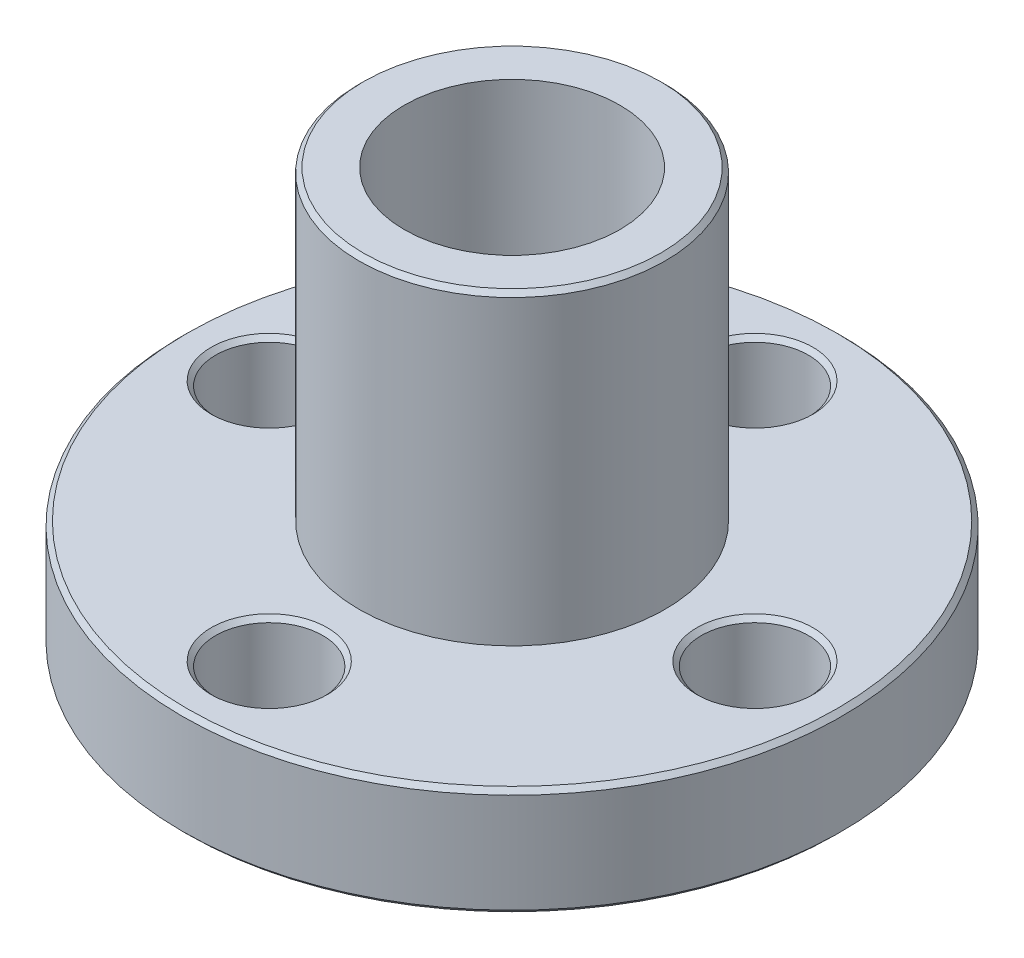
ISO-10303-21;
HEADER;
FILE_DESCRIPTION(('STEP AP214'),'2;1');
FILE_NAME('part.step','',(''),(''),'','','');
FILE_SCHEMA(('AUTOMOTIVE_DESIGN { 1 0 10303 214 1 1 1 1 }'));
ENDSEC;
DATA;
#1=APPLICATION_CONTEXT('core data for automotive mechanical design processes');
#2=APPLICATION_PROTOCOL_DEFINITION('international standard','automotive_design',2000,#1);
#3=PRODUCT_CONTEXT('',#1,'mechanical');
#4=PRODUCT('Part','Part','',(#3));
#5=PRODUCT_RELATED_PRODUCT_CATEGORY('part','',(#4));
#6=PRODUCT_DEFINITION_FORMATION('','',#4);
#7=PRODUCT_DEFINITION_CONTEXT('part definition',#1,'design');
#8=PRODUCT_DEFINITION('design','',#6,#7);
#9=PRODUCT_DEFINITION_SHAPE('','',#8);
#10=(LENGTH_UNIT() NAMED_UNIT(*) SI_UNIT(.MILLI.,.METRE.));
#11=(NAMED_UNIT(*) PLANE_ANGLE_UNIT() SI_UNIT($,.RADIAN.));
#12=(NAMED_UNIT(*) SI_UNIT($,.STERADIAN.) SOLID_ANGLE_UNIT());
#13=UNCERTAINTY_MEASURE_WITH_UNIT(LENGTH_MEASURE(1.E-05),#10,'distance_accuracy_value','');
#14=(GEOMETRIC_REPRESENTATION_CONTEXT(3) GLOBAL_UNCERTAINTY_ASSIGNED_CONTEXT((#13)) GLOBAL_UNIT_ASSIGNED_CONTEXT((#10,
#11,#12)) REPRESENTATION_CONTEXT('',''));
#15=CARTESIAN_POINT('',(0.,0.,0.));
#16=DIRECTION('',(0.,0.,1.));
#17=DIRECTION('',(1.,0.,0.));
#18=AXIS2_PLACEMENT_3D('',#15,#16,#17);
#19=CARTESIAN_POINT('',(0.,3.6,0.));
#20=DIRECTION('',(0.,-1.,0.));
#21=DIRECTION('',(0.,0.,-1.));
#22=AXIS2_PLACEMENT_3D('',#19,#20,#21);
#23=CYLINDRICAL_SURFACE('',#22,10.925);
#24=CARTESIAN_POINT('',(0.,3.45,0.));
#25=DIRECTION('',(0.,1.,0.));
#26=DIRECTION('',(0.,0.,1.));
#27=AXIS2_PLACEMENT_3D('',#24,#25,#26);
#28=CIRCLE('',#27,10.925);
#29=CARTESIAN_POINT('',(0.,3.45,10.925));
#30=VERTEX_POINT('',#29);
#31=EDGE_CURVE('E41',#30,#30,#28,.F.);
#32=ORIENTED_EDGE('',*,*,#31,.T.);
#33=EDGE_LOOP('',(#32));
#34=FACE_BOUND('',#33,.T.);
#35=CARTESIAN_POINT('',(0.,0.150000000000001,0.));
#36=DIRECTION('',(0.,1.,0.));
#37=DIRECTION('',(0.,0.,1.));
#38=AXIS2_PLACEMENT_3D('',#35,#36,#37);
#39=CIRCLE('',#38,10.925);
#40=CARTESIAN_POINT('',(0.,0.150000000000001,10.925));
#41=VERTEX_POINT('',#40);
#42=EDGE_CURVE('E45',#41,#41,#39,.T.);
#43=ORIENTED_EDGE('',*,*,#42,.T.);
#44=EDGE_LOOP('',(#43));
#45=FACE_BOUND('',#44,.T.);
#46=ADVANCED_FACE('F30',(#34,#45),#23,.T.);
#47=CARTESIAN_POINT('',(0.,3.6,0.));
#48=DIRECTION('',(0.,1.,0.));
#49=DIRECTION('',(0.,0.,1.));
#50=AXIS2_PLACEMENT_3D('',#47,#48,#49);
#51=PLANE('',#50);
#52=CARTESIAN_POINT('',(8.05,3.6,0.));
#53=DIRECTION('',(0.,1.,0.));
#54=DIRECTION('',(0.,0.,1.));
#55=AXIS2_PLACEMENT_3D('',#52,#53,#54);
#56=CIRCLE('',#55,1.925);
#57=CARTESIAN_POINT('',(8.05,3.6,1.925));
#58=VERTEX_POINT('',#57);
#59=EDGE_CURVE('E89',#58,#58,#56,.F.);
#60=ORIENTED_EDGE('',*,*,#59,.T.);
#61=EDGE_LOOP('',(#60));
#62=FACE_BOUND('',#61,.T.);
#63=CARTESIAN_POINT('',(0.,3.6,-8.05));
#64=DIRECTION('',(0.,1.,0.));
#65=DIRECTION('',(0.,0.,1.));
#66=AXIS2_PLACEMENT_3D('',#63,#64,#65);
#67=CIRCLE('',#66,1.925);
#68=CARTESIAN_POINT('',(0.,3.6,-6.125));
#69=VERTEX_POINT('',#68);
#70=EDGE_CURVE('E92',#69,#69,#67,.F.);
#71=ORIENTED_EDGE('',*,*,#70,.T.);
#72=EDGE_LOOP('',(#71));
#73=FACE_BOUND('',#72,.T.);
#74=CARTESIAN_POINT('',(0.,3.6,8.05));
#75=DIRECTION('',(0.,1.,0.));
#76=DIRECTION('',(0.,0.,1.));
#77=AXIS2_PLACEMENT_3D('',#74,#75,#76);
#78=CIRCLE('',#77,1.925);
#79=CARTESIAN_POINT('',(0.,3.6,9.975));
#80=VERTEX_POINT('',#79);
#81=EDGE_CURVE('E95',#80,#80,#78,.F.);
#82=ORIENTED_EDGE('',*,*,#81,.T.);
#83=EDGE_LOOP('',(#82));
#84=FACE_BOUND('',#83,.T.);
#85=CARTESIAN_POINT('',(-8.05,3.6,0.));
#86=DIRECTION('',(0.,1.,0.));
#87=DIRECTION('',(0.,0.,1.));
#88=AXIS2_PLACEMENT_3D('',#85,#86,#87);
#89=CIRCLE('',#88,1.925);
#90=CARTESIAN_POINT('',(-8.05,3.6,1.925));
#91=VERTEX_POINT('',#90);
#92=EDGE_CURVE('E98',#91,#91,#89,.F.);
#93=ORIENTED_EDGE('',*,*,#92,.T.);
#94=EDGE_LOOP('',(#93));
#95=FACE_BOUND('',#94,.T.);
#96=CARTESIAN_POINT('',(0.,3.6,0.));
#97=DIRECTION('',(0.,1.,0.));
#98=DIRECTION('',(0.,0.,1.));
#99=AXIS2_PLACEMENT_3D('',#96,#97,#98);
#100=CIRCLE('',#99,10.775);
#101=CARTESIAN_POINT('',(0.,3.6,10.775));
#102=VERTEX_POINT('',#101);
#103=EDGE_CURVE('E101',#102,#102,#100,.T.);
#104=ORIENTED_EDGE('',*,*,#103,.T.);
#105=EDGE_LOOP('',(#104));
#106=FACE_BOUND('',#105,.T.);
#107=CARTESIAN_POINT('',(0.,3.6,0.));
#108=DIRECTION('',(0.,1.,0.));
#109=DIRECTION('',(0.,0.,1.));
#110=AXIS2_PLACEMENT_3D('',#107,#108,#109);
#111=CIRCLE('',#110,5.075);
#112=CARTESIAN_POINT('',(0.,3.6,5.075));
#113=VERTEX_POINT('',#112);
#114=EDGE_CURVE('E113',#113,#113,#111,.T.);
#115=ORIENTED_EDGE('',*,*,#114,.F.);
#116=EDGE_LOOP('',(#115));
#117=FACE_BOUND('',#116,.T.);
#118=ADVANCED_FACE('F139',(#62,#73,#84,#95,#106,#117),#51,.T.);
#119=CARTESIAN_POINT('',(0.,0.,0.));
#120=DIRECTION('',(0.,1.,0.));
#121=DIRECTION('',(0.,0.,1.));
#122=AXIS2_PLACEMENT_3D('',#119,#120,#121);
#123=PLANE('',#122);
#124=CARTESIAN_POINT('',(8.05,0.,0.));
#125=DIRECTION('',(0.,1.,0.));
#126=DIRECTION('',(0.,0.,1.));
#127=AXIS2_PLACEMENT_3D('',#124,#125,#126);
#128=CIRCLE('',#127,1.925);
#129=CARTESIAN_POINT('',(8.05,0.,1.925));
#130=VERTEX_POINT('',#129);
#131=EDGE_CURVE('E56',#130,#130,#128,.T.);
#132=ORIENTED_EDGE('',*,*,#131,.T.);
#133=EDGE_LOOP('',(#132));
#134=FACE_BOUND('',#133,.T.);
#135=CARTESIAN_POINT('',(0.,0.,-8.05));
#136=DIRECTION('',(0.,1.,0.));
#137=DIRECTION('',(0.,0.,1.));
#138=AXIS2_PLACEMENT_3D('',#135,#136,#137);
#139=CIRCLE('',#138,1.925);
#140=CARTESIAN_POINT('',(0.,0.,-6.125));
#141=VERTEX_POINT('',#140);
#142=EDGE_CURVE('E59',#141,#141,#139,.T.);
#143=ORIENTED_EDGE('',*,*,#142,.T.);
#144=EDGE_LOOP('',(#143));
#145=FACE_BOUND('',#144,.T.);
#146=CARTESIAN_POINT('',(-8.05,0.,0.));
#147=DIRECTION('',(0.,1.,0.));
#148=DIRECTION('',(0.,0.,1.));
#149=AXIS2_PLACEMENT_3D('',#146,#147,#148);
#150=CIRCLE('',#149,1.925);
#151=CARTESIAN_POINT('',(-8.05,0.,1.925));
#152=VERTEX_POINT('',#151);
#153=EDGE_CURVE('E62',#152,#152,#150,.T.);
#154=ORIENTED_EDGE('',*,*,#153,.T.);
#155=EDGE_LOOP('',(#154));
#156=FACE_BOUND('',#155,.T.);
#157=CARTESIAN_POINT('',(0.,0.,8.05));
#158=DIRECTION('',(0.,1.,0.));
#159=DIRECTION('',(0.,0.,1.));
#160=AXIS2_PLACEMENT_3D('',#157,#158,#159);
#161=CIRCLE('',#160,1.925);
#162=CARTESIAN_POINT('',(0.,0.,9.975));
#163=VERTEX_POINT('',#162);
#164=EDGE_CURVE('E65',#163,#163,#161,.T.);
#165=ORIENTED_EDGE('',*,*,#164,.T.);
#166=EDGE_LOOP('',(#165));
#167=FACE_BOUND('',#166,.T.);
#168=CARTESIAN_POINT('',(0.,0.,0.));
#169=DIRECTION('',(0.,1.,0.));
#170=DIRECTION('',(0.,0.,1.));
#171=AXIS2_PLACEMENT_3D('',#168,#169,#170);
#172=CIRCLE('',#171,10.775);
#173=CARTESIAN_POINT('',(0.,0.,10.775));
#174=VERTEX_POINT('',#173);
#175=EDGE_CURVE('E68',#174,#174,#172,.F.);
#176=ORIENTED_EDGE('',*,*,#175,.T.);
#177=EDGE_LOOP('',(#176));
#178=FACE_BOUND('',#177,.T.);
#179=CARTESIAN_POINT('',(0.,0.,0.));
#180=DIRECTION('',(0.,1.,0.));
#181=DIRECTION('',(0.,0.,1.));
#182=AXIS2_PLACEMENT_3D('',#179,#180,#181);
#183=CIRCLE('',#182,5.075);
#184=CARTESIAN_POINT('',(0.,0.,5.075));
#185=VERTEX_POINT('',#184);
#186=EDGE_CURVE('E110',#185,#185,#183,.F.);
#187=ORIENTED_EDGE('',*,*,#186,.F.);
#188=EDGE_LOOP('',(#187));
#189=FACE_BOUND('',#188,.T.);
#190=ADVANCED_FACE('F145',(#134,#145,#156,#167,#178,#189),#123,.F.);
#191=CARTESIAN_POINT('',(-8.05,0.,0.));
#192=DIRECTION('',(0.,1.,0.));
#193=DIRECTION('',(0.,0.,1.));
#194=AXIS2_PLACEMENT_3D('',#191,#192,#193);
#195=CYLINDRICAL_SURFACE('',#194,1.775);
#196=CARTESIAN_POINT('',(-8.05,3.45,0.));
#197=DIRECTION('',(0.,1.,0.));
#198=DIRECTION('',(0.,0.,1.));
#199=AXIS2_PLACEMENT_3D('',#196,#197,#198);
#200=CIRCLE('',#199,1.775);
#201=CARTESIAN_POINT('',(-8.05,3.45,1.775));
#202=VERTEX_POINT('',#201);
#203=EDGE_CURVE('E71',#202,#202,#200,.T.);
#204=ORIENTED_EDGE('',*,*,#203,.T.);
#205=EDGE_LOOP('',(#204));
#206=FACE_BOUND('',#205,.T.);
#207=CARTESIAN_POINT('',(-8.05,0.15,0.));
#208=DIRECTION('',(0.,1.,0.));
#209=DIRECTION('',(0.,0.,1.));
#210=AXIS2_PLACEMENT_3D('',#207,#208,#209);
#211=CIRCLE('',#210,1.775);
#212=CARTESIAN_POINT('',(-8.05,0.15,1.775));
#213=VERTEX_POINT('',#212);
#214=EDGE_CURVE('E74',#213,#213,#211,.F.);
#215=ORIENTED_EDGE('',*,*,#214,.T.);
#216=EDGE_LOOP('',(#215));
#217=FACE_BOUND('',#216,.T.);
#218=ADVANCED_FACE('F202',(#206,#217),#195,.F.);
#219=CARTESIAN_POINT('',(0.,0.,-8.05));
#220=DIRECTION('',(0.,1.,0.));
#221=DIRECTION('',(0.,0.,1.));
#222=AXIS2_PLACEMENT_3D('',#219,#220,#221);
#223=CYLINDRICAL_SURFACE('',#222,1.775);
#224=CARTESIAN_POINT('',(0.,3.45,-8.05));
#225=DIRECTION('',(0.,1.,0.));
#226=DIRECTION('',(0.,0.,1.));
#227=AXIS2_PLACEMENT_3D('',#224,#225,#226);
#228=CIRCLE('',#227,1.775);
#229=CARTESIAN_POINT('',(0.,3.45,-6.275));
#230=VERTEX_POINT('',#229);
#231=EDGE_CURVE('E83',#230,#230,#228,.T.);
#232=ORIENTED_EDGE('',*,*,#231,.T.);
#233=EDGE_LOOP('',(#232));
#234=FACE_BOUND('',#233,.T.);
#235=CARTESIAN_POINT('',(0.,0.149999999999999,-8.05));
#236=DIRECTION('',(0.,1.,0.));
#237=DIRECTION('',(0.,0.,1.));
#238=AXIS2_PLACEMENT_3D('',#235,#236,#237);
#239=CIRCLE('',#238,1.775);
#240=CARTESIAN_POINT('',(0.,0.149999999999999,-6.275));
#241=VERTEX_POINT('',#240);
#242=EDGE_CURVE('E86',#241,#241,#239,.F.);
#243=ORIENTED_EDGE('',*,*,#242,.T.);
#244=EDGE_LOOP('',(#243));
#245=FACE_BOUND('',#244,.T.);
#246=ADVANCED_FACE('F209',(#234,#245),#223,.F.);
#247=CARTESIAN_POINT('',(0.,0.,8.05));
#248=DIRECTION('',(0.,1.,0.));
#249=DIRECTION('',(0.,0.,1.));
#250=AXIS2_PLACEMENT_3D('',#247,#248,#249);
#251=CYLINDRICAL_SURFACE('',#250,1.775);
#252=CARTESIAN_POINT('',(0.,3.45,8.05));
#253=DIRECTION('',(0.,1.,0.));
#254=DIRECTION('',(0.,0.,1.));
#255=AXIS2_PLACEMENT_3D('',#252,#253,#254);
#256=CIRCLE('',#255,1.775);
#257=CARTESIAN_POINT('',(0.,3.45,9.825));
#258=VERTEX_POINT('',#257);
#259=EDGE_CURVE('E77',#258,#258,#256,.T.);
#260=ORIENTED_EDGE('',*,*,#259,.T.);
#261=EDGE_LOOP('',(#260));
#262=FACE_BOUND('',#261,.T.);
#263=CARTESIAN_POINT('',(0.,0.150000000000006,8.05));
#264=DIRECTION('',(0.,1.,0.));
#265=DIRECTION('',(0.,0.,1.));
#266=AXIS2_PLACEMENT_3D('',#263,#264,#265);
#267=CIRCLE('',#266,1.775);
#268=CARTESIAN_POINT('',(0.,0.150000000000006,9.825));
#269=VERTEX_POINT('',#268);
#270=EDGE_CURVE('E80',#269,#269,#267,.F.);
#271=ORIENTED_EDGE('',*,*,#270,.T.);
#272=EDGE_LOOP('',(#271));
#273=FACE_BOUND('',#272,.T.);
#274=ADVANCED_FACE('F226',(#262,#273),#251,.F.);
#275=CARTESIAN_POINT('',(8.05,0.,0.));
#276=DIRECTION('',(0.,1.,0.));
#277=DIRECTION('',(0.,0.,1.));
#278=AXIS2_PLACEMENT_3D('',#275,#276,#277);
#279=CYLINDRICAL_SURFACE('',#278,1.775);
#280=CARTESIAN_POINT('',(8.05,3.45,0.));
#281=DIRECTION('',(0.,1.,0.));
#282=DIRECTION('',(0.,0.,1.));
#283=AXIS2_PLACEMENT_3D('',#280,#281,#282);
#284=CIRCLE('',#283,1.775);
#285=CARTESIAN_POINT('',(8.05,3.45,1.775));
#286=VERTEX_POINT('',#285);
#287=EDGE_CURVE('E104',#286,#286,#284,.T.);
#288=ORIENTED_EDGE('',*,*,#287,.T.);
#289=EDGE_LOOP('',(#288));
#290=FACE_BOUND('',#289,.T.);
#291=CARTESIAN_POINT('',(8.05,0.150000000000006,0.));
#292=DIRECTION('',(0.,1.,0.));
#293=DIRECTION('',(0.,0.,1.));
#294=AXIS2_PLACEMENT_3D('',#291,#292,#293);
#295=CIRCLE('',#294,1.775);
#296=CARTESIAN_POINT('',(8.05,0.150000000000006,1.775));
#297=VERTEX_POINT('',#296);
#298=EDGE_CURVE('E107',#297,#297,#295,.F.);
#299=ORIENTED_EDGE('',*,*,#298,.T.);
#300=EDGE_LOOP('',(#299));
#301=FACE_BOUND('',#300,.T.);
#302=ADVANCED_FACE('F233',(#290,#301),#279,.F.);
#303=CARTESIAN_POINT('',(0.,13.75,0.));
#304=DIRECTION('',(0.,-1.,0.));
#305=DIRECTION('',(0.,0.,-1.));
#306=AXIS2_PLACEMENT_3D('',#303,#304,#305);
#307=CYLINDRICAL_SURFACE('',#306,5.075);
#308=CARTESIAN_POINT('',(0.,13.6,0.));
#309=DIRECTION('',(0.,1.,0.));
#310=DIRECTION('',(0.,0.,1.));
#311=AXIS2_PLACEMENT_3D('',#308,#309,#310);
#312=CIRCLE('',#311,5.075);
#313=CARTESIAN_POINT('',(0.,13.6,5.075));
#314=VERTEX_POINT('',#313);
#315=EDGE_CURVE('E50',#314,#314,#312,.F.);
#316=ORIENTED_EDGE('',*,*,#315,.T.);
#317=EDGE_LOOP('',(#316));
#318=FACE_BOUND('',#317,.T.);
#319=ORIENTED_EDGE('',*,*,#114,.T.);
#320=EDGE_LOOP('',(#319));
#321=FACE_BOUND('',#320,.T.);
#322=ADVANCED_FACE('F237',(#318,#321),#307,.T.);
#323=CARTESIAN_POINT('',(0.,13.75,0.));
#324=DIRECTION('',(0.,1.,0.));
#325=DIRECTION('',(0.,0.,1.));
#326=AXIS2_PLACEMENT_3D('',#323,#324,#325);
#327=PLANE('',#326);
#328=CARTESIAN_POINT('',(0.,13.75,0.));
#329=DIRECTION('',(0.,1.,0.));
#330=DIRECTION('',(0.,0.,1.));
#331=AXIS2_PLACEMENT_3D('',#328,#329,#330);
#332=CIRCLE('',#331,4.925);
#333=CARTESIAN_POINT('',(0.,13.75,4.925));
#334=VERTEX_POINT('',#333);
#335=EDGE_CURVE('E53',#334,#334,#332,.T.);
#336=ORIENTED_EDGE('',*,*,#335,.T.);
#337=EDGE_LOOP('',(#336));
#338=FACE_BOUND('',#337,.T.);
#339=CARTESIAN_POINT('',(0.,13.75,0.));
#340=DIRECTION('',(0.,1.,0.));
#341=DIRECTION('',(0.,0.,1.));
#342=AXIS2_PLACEMENT_3D('',#339,#340,#341);
#343=CIRCLE('',#342,3.575);
#344=CARTESIAN_POINT('',(0.,13.75,3.575));
#345=VERTEX_POINT('',#344);
#346=EDGE_CURVE('E116',#345,#345,#343,.T.);
#347=ORIENTED_EDGE('',*,*,#346,.F.);
#348=EDGE_LOOP('',(#347));
#349=FACE_BOUND('',#348,.T.);
#350=ADVANCED_FACE('F136',(#338,#349),#327,.T.);
#351=CARTESIAN_POINT('',(0.,-1.5,0.));
#352=DIRECTION('',(0.,1.,0.));
#353=DIRECTION('',(0.,0.,1.));
#354=AXIS2_PLACEMENT_3D('',#351,#352,#353);
#355=CYLINDRICAL_SURFACE('',#354,5.075);
#356=CARTESIAN_POINT('',(0.,-1.34999999999999,0.));
#357=DIRECTION('',(0.,-1.,0.));
#358=DIRECTION('',(0.,0.,-1.));
#359=AXIS2_PLACEMENT_3D('',#356,#357,#358);
#360=CIRCLE('',#359,5.075);
#361=CARTESIAN_POINT('',(0.,-1.34999999999999,-5.075));
#362=VERTEX_POINT('',#361);
#363=EDGE_CURVE('E10',#362,#362,#360,.F.);
#364=ORIENTED_EDGE('',*,*,#363,.T.);
#365=EDGE_LOOP('',(#364));
#366=FACE_BOUND('',#365,.T.);
#367=ORIENTED_EDGE('',*,*,#186,.T.);
#368=EDGE_LOOP('',(#367));
#369=FACE_BOUND('',#368,.T.);
#370=ADVANCED_FACE('F127',(#366,#369),#355,.T.);
#371=CARTESIAN_POINT('',(0.,-1.5,0.));
#372=DIRECTION('',(0.,-1.,0.));
#373=DIRECTION('',(0.,0.,-1.));
#374=AXIS2_PLACEMENT_3D('',#371,#372,#373);
#375=PLANE('',#374);
#376=CARTESIAN_POINT('',(0.,-1.5,0.));
#377=DIRECTION('',(0.,-1.,0.));
#378=DIRECTION('',(0.,0.,-1.));
#379=AXIS2_PLACEMENT_3D('',#376,#377,#378);
#380=CIRCLE('',#379,4.925);
#381=CARTESIAN_POINT('',(0.,-1.5,-4.925));
#382=VERTEX_POINT('',#381);
#383=EDGE_CURVE('E37',#382,#382,#380,.T.);
#384=ORIENTED_EDGE('',*,*,#383,.T.);
#385=EDGE_LOOP('',(#384));
#386=FACE_BOUND('',#385,.T.);
#387=CARTESIAN_POINT('',(0.,-1.5,0.));
#388=DIRECTION('',(0.,-1.,0.));
#389=DIRECTION('',(0.,0.,-1.));
#390=AXIS2_PLACEMENT_3D('',#387,#388,#389);
#391=CIRCLE('',#390,3.575);
#392=CARTESIAN_POINT('',(0.,-1.5,-3.575));
#393=VERTEX_POINT('',#392);
#394=EDGE_CURVE('E119',#393,#393,#391,.T.);
#395=ORIENTED_EDGE('',*,*,#394,.F.);
#396=EDGE_LOOP('',(#395));
#397=FACE_BOUND('',#396,.T.);
#398=ADVANCED_FACE('F125',(#386,#397),#375,.T.);
#399=CARTESIAN_POINT('',(0.,30.,0.));
#400=DIRECTION('',(0.,-1.,0.));
#401=DIRECTION('',(0.,0.,-1.));
#402=AXIS2_PLACEMENT_3D('',#399,#400,#401);
#403=CYLINDRICAL_SURFACE('',#402,3.575);
#404=ORIENTED_EDGE('',*,*,#346,.T.);
#405=EDGE_LOOP('',(#404));
#406=FACE_BOUND('',#405,.T.);
#407=ORIENTED_EDGE('',*,*,#394,.T.);
#408=EDGE_LOOP('',(#407));
#409=FACE_BOUND('',#408,.T.);
#410=ADVANCED_FACE('F123',(#406,#409),#403,.F.);
#411=CARTESIAN_POINT('',(8.05,3.45,0.));
#412=DIRECTION('',(0.,1.,0.));
#413=DIRECTION('',(0.,0.,1.));
#414=AXIS2_PLACEMENT_3D('',#411,#412,#413);
#415=CONICAL_SURFACE('',#414,1.775,0.785398163397447);
#416=ORIENTED_EDGE('',*,*,#59,.F.);
#417=EDGE_LOOP('',(#416));
#418=FACE_BOUND('',#417,.T.);
#419=ORIENTED_EDGE('',*,*,#287,.F.);
#420=EDGE_LOOP('',(#419));
#421=FACE_BOUND('',#420,.T.);
#422=ADVANCED_FACE('F133',(#418,#421),#415,.F.);
#423=CARTESIAN_POINT('',(0.,3.45,-8.05));
#424=DIRECTION('',(0.,1.,0.));
#425=DIRECTION('',(0.,0.,1.));
#426=AXIS2_PLACEMENT_3D('',#423,#424,#425);
#427=CONICAL_SURFACE('',#426,1.775,0.785398163397447);
#428=ORIENTED_EDGE('',*,*,#70,.F.);
#429=EDGE_LOOP('',(#428));
#430=FACE_BOUND('',#429,.T.);
#431=ORIENTED_EDGE('',*,*,#231,.F.);
#432=EDGE_LOOP('',(#431));
#433=FACE_BOUND('',#432,.T.);
#434=ADVANCED_FACE('F153',(#430,#433),#427,.F.);
#435=CARTESIAN_POINT('',(0.,3.45,8.05));
#436=DIRECTION('',(0.,1.,0.));
#437=DIRECTION('',(0.,0.,1.));
#438=AXIS2_PLACEMENT_3D('',#435,#436,#437);
#439=CONICAL_SURFACE('',#438,1.775,0.785398163397447);
#440=ORIENTED_EDGE('',*,*,#81,.F.);
#441=EDGE_LOOP('',(#440));
#442=FACE_BOUND('',#441,.T.);
#443=ORIENTED_EDGE('',*,*,#259,.F.);
#444=EDGE_LOOP('',(#443));
#445=FACE_BOUND('',#444,.T.);
#446=ADVANCED_FACE('F157',(#442,#445),#439,.F.);
#447=CARTESIAN_POINT('',(-8.05,3.45,0.));
#448=DIRECTION('',(0.,1.,0.));
#449=DIRECTION('',(0.,0.,1.));
#450=AXIS2_PLACEMENT_3D('',#447,#448,#449);
#451=CONICAL_SURFACE('',#450,1.775,0.785398163397447);
#452=CARTESIAN_POINT('',(-8.05,3.6,1.925));
#453=CARTESIAN_POINT('',(-8.05,3.5984375,1.9234375));
#454=CARTESIAN_POINT('',(-8.05,3.596875,1.921875));
#455=CARTESIAN_POINT('',(-8.05,3.59375,1.91875));
#456=CARTESIAN_POINT('',(-8.05,3.5921875,1.9171875));
#457=CARTESIAN_POINT('',(-8.05,3.5890625,1.9140625));
#458=CARTESIAN_POINT('',(-8.05,3.5875,1.9125));
#459=CARTESIAN_POINT('',(-8.05,3.584375,1.909375));
#460=CARTESIAN_POINT('',(-8.05,3.5828125,1.9078125));
#461=CARTESIAN_POINT('',(-8.05,3.5796875,1.9046875));
#462=CARTESIAN_POINT('',(-8.05,3.578125,1.903125));
#463=CARTESIAN_POINT('',(-8.05,3.575,1.9));
#464=CARTESIAN_POINT('',(-8.05,3.5734375,1.8984375));
#465=CARTESIAN_POINT('',(-8.05,3.5703125,1.8953125));
#466=CARTESIAN_POINT('',(-8.05,3.56875,1.89375));
#467=CARTESIAN_POINT('',(-8.05,3.565625,1.890625));
#468=CARTESIAN_POINT('',(-8.05,3.5640625,1.8890625));
#469=CARTESIAN_POINT('',(-8.05,3.5609375,1.8859375));
#470=CARTESIAN_POINT('',(-8.05,3.559375,1.884375));
#471=CARTESIAN_POINT('',(-8.05,3.55625,1.88125));
#472=CARTESIAN_POINT('',(-8.05,3.5546875,1.8796875));
#473=CARTESIAN_POINT('',(-8.05,3.5515625,1.8765625));
#474=CARTESIAN_POINT('',(-8.05,3.55,1.875));
#475=CARTESIAN_POINT('',(-8.05,3.546875,1.871875));
#476=CARTESIAN_POINT('',(-8.05,3.5453125,1.8703125));
#477=CARTESIAN_POINT('',(-8.05,3.5421875,1.8671875));
#478=CARTESIAN_POINT('',(-8.05,3.540625,1.865625));
#479=CARTESIAN_POINT('',(-8.05,3.5375,1.8625));
#480=CARTESIAN_POINT('',(-8.05,3.5359375,1.8609375));
#481=CARTESIAN_POINT('',(-8.05,3.5328125,1.8578125));
#482=CARTESIAN_POINT('',(-8.05,3.53125,1.85625));
#483=CARTESIAN_POINT('',(-8.05,3.528125,1.853125));
#484=CARTESIAN_POINT('',(-8.05,3.5265625,1.8515625));
#485=CARTESIAN_POINT('',(-8.05,3.5234375,1.8484375));
#486=CARTESIAN_POINT('',(-8.05,3.521875,1.846875));
#487=CARTESIAN_POINT('',(-8.05,3.51875,1.84375));
#488=CARTESIAN_POINT('',(-8.05,3.5171875,1.8421875));
#489=CARTESIAN_POINT('',(-8.05,3.5140625,1.8390625));
#490=CARTESIAN_POINT('',(-8.05,3.5125,1.8375));
#491=CARTESIAN_POINT('',(-8.05,3.509375,1.834375));
#492=CARTESIAN_POINT('',(-8.05,3.5078125,1.8328125));
#493=CARTESIAN_POINT('',(-8.05,3.5046875,1.8296875));
#494=CARTESIAN_POINT('',(-8.05,3.503125,1.828125));
#495=CARTESIAN_POINT('',(-8.05,3.5,1.825));
#496=CARTESIAN_POINT('',(-8.05,3.4984375,1.8234375));
#497=CARTESIAN_POINT('',(-8.05,3.4953125,1.8203125));
#498=CARTESIAN_POINT('',(-8.05,3.49375,1.81875));
#499=CARTESIAN_POINT('',(-8.05,3.490625,1.815625));
#500=CARTESIAN_POINT('',(-8.05,3.4890625,1.8140625));
#501=CARTESIAN_POINT('',(-8.05,3.4859375,1.8109375));
#502=CARTESIAN_POINT('',(-8.05,3.484375,1.809375));
#503=CARTESIAN_POINT('',(-8.05,3.48125,1.80625));
#504=CARTESIAN_POINT('',(-8.05,3.4796875,1.8046875));
#505=CARTESIAN_POINT('',(-8.05,3.4765625,1.8015625));
#506=CARTESIAN_POINT('',(-8.05,3.475,1.8));
#507=CARTESIAN_POINT('',(-8.05,3.471875,1.796875));
#508=CARTESIAN_POINT('',(-8.05,3.4703125,1.7953125));
#509=CARTESIAN_POINT('',(-8.05,3.4671875,1.7921875));
#510=CARTESIAN_POINT('',(-8.05,3.465625,1.790625));
#511=CARTESIAN_POINT('',(-8.05,3.4625,1.7875));
#512=CARTESIAN_POINT('',(-8.05,3.4609375,1.7859375));
#513=CARTESIAN_POINT('',(-8.05,3.4578125,1.7828125));
#514=CARTESIAN_POINT('',(-8.05,3.45625,1.78125));
#515=CARTESIAN_POINT('',(-8.05,3.453125,1.778125));
#516=CARTESIAN_POINT('',(-8.05,3.4515625,1.7765625));
#517=CARTESIAN_POINT('',(-8.05,3.45,1.775));
#518=B_SPLINE_CURVE_WITH_KNOTS('',3,(#452,#453,#454,#455,#456,#457,#458,#459,#460,#461,#462,
#463,#464,#465,#466,#467,#468,#469,#470,#471,#472,#473,#474,#475,#476,#477,#478,#479,#480,#481,
#482,#483,#484,#485,#486,#487,#488,#489,#490,#491,#492,#493,#494,#495,#496,#497,#498,#499,#500,
#501,#502,#503,#504,#505,#506,#507,#508,#509,#510,#511,#512,#513,#514,#515,#516,#517),
.UNSPECIFIED.,.F.,.F.,(4,2,2,2,2,2,2,2,2,2,2,2,2,2,2,2,2,2,2,2,2,2,2,2,2,2,2,2,2,2,2,2,4),(0.,
0.00662912607362377,0.0132582521472477,0.0198873782208715,0.0265165042944952,0.0331456303681194,
0.0397747564417432,0.0464038825153671,0.0530330085889909,0.059662134662615,0.0662912607362389,
0.0729203868098627,0.0795495128834864,0.0861786389571104,0.0928077650307344,0.0994368911043583,
0.106066017177982,0.112695143251606,0.11932426932523,0.125953395398854,0.132582521472478,
0.139211647546102,0.145840773619725,0.15246989969335,0.159099025766973,0.165728151840597,
0.172357277914221,0.178986403987845,0.185615530061469,0.192244656135093,0.198873782208716,
0.20550290828234,0.212132034355964),.UNSPECIFIED.);
#519=EDGE_CURVE('BSEAM161',#91,#202,#518,.T.);
#520=ORIENTED_EDGE('',*,*,#92,.F.);
#521=ORIENTED_EDGE('',*,*,#203,.F.);
#522=ORIENTED_EDGE('',*,*,#519,.T.);
#523=ORIENTED_EDGE('',*,*,#519,.F.);
#524=EDGE_LOOP('',(#520,#522,#521,#523));
#525=FACE_BOUND('',#524,.T.);
#526=ADVANCED_FACE('F161',(#525),#451,.F.);
#527=CARTESIAN_POINT('',(8.05,0.,0.));
#528=DIRECTION('',(0.,-1.,0.));
#529=DIRECTION('',(0.,0.,-1.));
#530=AXIS2_PLACEMENT_3D('',#527,#528,#529);
#531=CONICAL_SURFACE('',#530,1.925,0.785398163397439);
#532=ORIENTED_EDGE('',*,*,#298,.F.);
#533=EDGE_LOOP('',(#532));
#534=FACE_BOUND('',#533,.T.);
#535=ORIENTED_EDGE('',*,*,#131,.F.);
#536=EDGE_LOOP('',(#535));
#537=FACE_BOUND('',#536,.T.);
#538=ADVANCED_FACE('F165',(#534,#537),#531,.F.);
#539=CARTESIAN_POINT('',(0.,0.,-8.05));
#540=DIRECTION('',(0.,-1.,0.));
#541=DIRECTION('',(0.,0.,-1.));
#542=AXIS2_PLACEMENT_3D('',#539,#540,#541);
#543=CONICAL_SURFACE('',#542,1.925,0.785398163397451);
#544=ORIENTED_EDGE('',*,*,#242,.F.);
#545=EDGE_LOOP('',(#544));
#546=FACE_BOUND('',#545,.T.);
#547=ORIENTED_EDGE('',*,*,#142,.F.);
#548=EDGE_LOOP('',(#547));
#549=FACE_BOUND('',#548,.T.);
#550=ADVANCED_FACE('F169',(#546,#549),#543,.F.);
#551=CARTESIAN_POINT('',(-8.05,0.,0.));
#552=DIRECTION('',(0.,-1.,0.));
#553=DIRECTION('',(0.,0.,-1.));
#554=AXIS2_PLACEMENT_3D('',#551,#552,#553);
#555=CONICAL_SURFACE('',#554,1.925,0.78539816339745);
#556=ORIENTED_EDGE('',*,*,#214,.F.);
#557=EDGE_LOOP('',(#556));
#558=FACE_BOUND('',#557,.T.);
#559=ORIENTED_EDGE('',*,*,#153,.F.);
#560=EDGE_LOOP('',(#559));
#561=FACE_BOUND('',#560,.T.);
#562=ADVANCED_FACE('F173',(#558,#561),#555,.F.);
#563=CARTESIAN_POINT('',(0.,0.,8.05));
#564=DIRECTION('',(0.,-1.,0.));
#565=DIRECTION('',(0.,0.,-1.));
#566=AXIS2_PLACEMENT_3D('',#563,#564,#565);
#567=CONICAL_SURFACE('',#566,1.925,0.785398163397439);
#568=ORIENTED_EDGE('',*,*,#270,.F.);
#569=EDGE_LOOP('',(#568));
#570=FACE_BOUND('',#569,.T.);
#571=ORIENTED_EDGE('',*,*,#164,.F.);
#572=EDGE_LOOP('',(#571));
#573=FACE_BOUND('',#572,.T.);
#574=ADVANCED_FACE('F177',(#570,#573),#567,.F.);
#575=CARTESIAN_POINT('',(0.,13.75,0.));
#576=DIRECTION('',(0.,-1.,0.));
#577=DIRECTION('',(0.,0.,-1.));
#578=AXIS2_PLACEMENT_3D('',#575,#576,#577);
#579=CONICAL_SURFACE('',#578,4.925,0.78539816339744);
#580=ORIENTED_EDGE('',*,*,#315,.F.);
#581=EDGE_LOOP('',(#580));
#582=FACE_BOUND('',#581,.T.);
#583=ORIENTED_EDGE('',*,*,#335,.F.);
#584=EDGE_LOOP('',(#583));
#585=FACE_BOUND('',#584,.T.);
#586=ADVANCED_FACE('F181',(#582,#585),#579,.T.);
#587=CARTESIAN_POINT('',(0.,3.6,0.));
#588=DIRECTION('',(0.,-1.,0.));
#589=DIRECTION('',(0.,0.,-1.));
#590=AXIS2_PLACEMENT_3D('',#587,#588,#589);
#591=CONICAL_SURFACE('',#590,10.775,0.785398163397431);
#592=ORIENTED_EDGE('',*,*,#31,.F.);
#593=EDGE_LOOP('',(#592));
#594=FACE_BOUND('',#593,.T.);
#595=ORIENTED_EDGE('',*,*,#103,.F.);
#596=EDGE_LOOP('',(#595));
#597=FACE_BOUND('',#596,.T.);
#598=ADVANCED_FACE('F185',(#594,#597),#591,.T.);
#599=CARTESIAN_POINT('',(0.,0.150000000000001,0.));
#600=DIRECTION('',(0.,1.,0.));
#601=DIRECTION('',(0.,0.,1.));
#602=AXIS2_PLACEMENT_3D('',#599,#600,#601);
#603=CONICAL_SURFACE('',#602,10.925,0.785398163397448);
#604=ORIENTED_EDGE('',*,*,#175,.F.);
#605=EDGE_LOOP('',(#604));
#606=FACE_BOUND('',#605,.T.);
#607=ORIENTED_EDGE('',*,*,#42,.F.);
#608=EDGE_LOOP('',(#607));
#609=FACE_BOUND('',#608,.T.);
#610=ADVANCED_FACE('F188',(#606,#609),#603,.T.);
#611=CARTESIAN_POINT('',(0.,-1.5,0.));
#612=DIRECTION('',(0.,1.,0.));
#613=DIRECTION('',(0.,0.,1.));
#614=AXIS2_PLACEMENT_3D('',#611,#612,#613);
#615=CONICAL_SURFACE('',#614,4.925,0.785398163397437);
#616=ORIENTED_EDGE('',*,*,#363,.F.);
#617=EDGE_LOOP('',(#616));
#618=FACE_BOUND('',#617,.T.);
#619=ORIENTED_EDGE('',*,*,#383,.F.);
#620=EDGE_LOOP('',(#619));
#621=FACE_BOUND('',#620,.T.);
#622=ADVANCED_FACE('F32',(#618,#621),#615,.T.);
#623=CLOSED_SHELL('',(#46,#118,#190,#218,#246,#274,#302,#322,#350,#370,#398,#410,#422,#434,#446,
#526,#538,#550,#562,#574,#586,#598,#610,#622));
#624=MANIFOLD_SOLID_BREP('B2',#623);
#625=ADVANCED_BREP_SHAPE_REPRESENTATION('',(#18,#624),#14);
#626=SHAPE_DEFINITION_REPRESENTATION(#9,#625);
ENDSEC;
END-ISO-10303-21;
